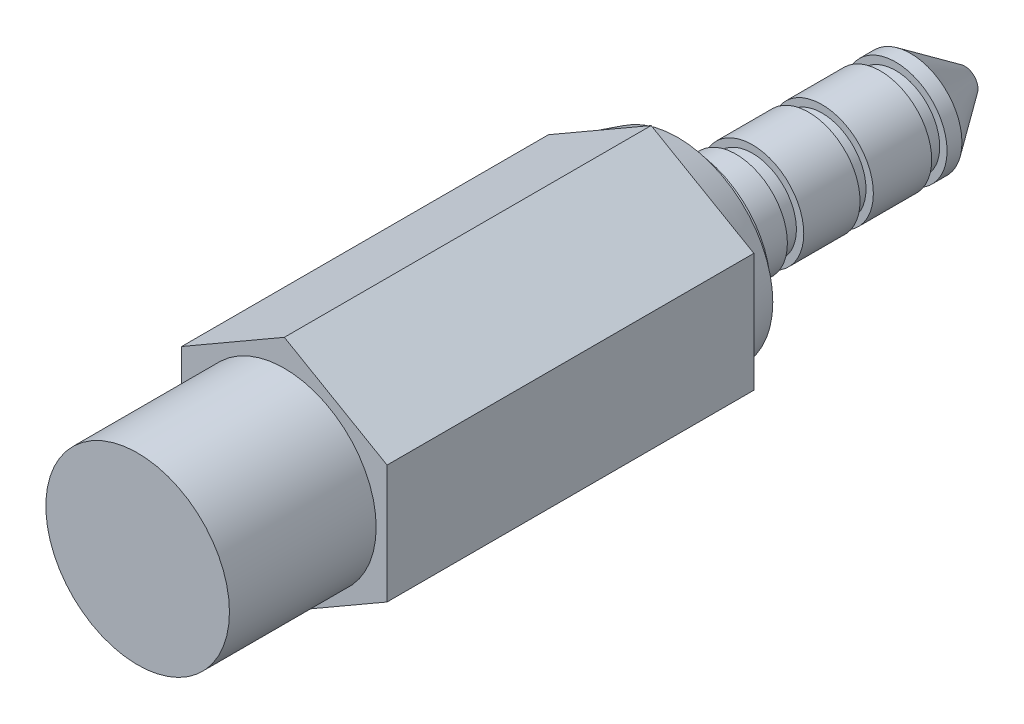
ISO-10303-21;
HEADER;
FILE_DESCRIPTION(('STEP AP214'),'2;1');
FILE_NAME('part.step','',(''),(''),'','','');
FILE_SCHEMA(('AUTOMOTIVE_DESIGN { 1 0 10303 214 1 1 1 1 }'));
ENDSEC;
DATA;
#1=APPLICATION_CONTEXT('core data for automotive mechanical design processes');
#2=APPLICATION_PROTOCOL_DEFINITION('international standard','automotive_design',2000,#1);
#3=PRODUCT_CONTEXT('',#1,'mechanical');
#4=PRODUCT('Part','Part','',(#3));
#5=PRODUCT_RELATED_PRODUCT_CATEGORY('part','',(#4));
#6=PRODUCT_DEFINITION_FORMATION('','',#4);
#7=PRODUCT_DEFINITION_CONTEXT('part definition',#1,'design');
#8=PRODUCT_DEFINITION('design','',#6,#7);
#9=PRODUCT_DEFINITION_SHAPE('','',#8);
#10=(LENGTH_UNIT() NAMED_UNIT(*) SI_UNIT(.MILLI.,.METRE.));
#11=(NAMED_UNIT(*) PLANE_ANGLE_UNIT() SI_UNIT($,.RADIAN.));
#12=(NAMED_UNIT(*) SI_UNIT($,.STERADIAN.) SOLID_ANGLE_UNIT());
#13=UNCERTAINTY_MEASURE_WITH_UNIT(LENGTH_MEASURE(1.E-05),#10,'distance_accuracy_value','');
#14=(GEOMETRIC_REPRESENTATION_CONTEXT(3) GLOBAL_UNCERTAINTY_ASSIGNED_CONTEXT((#13)) GLOBAL_UNIT_ASSIGNED_CONTEXT((#10,
#11,#12)) REPRESENTATION_CONTEXT('',''));
#15=CARTESIAN_POINT('',(0.,0.,0.));
#16=DIRECTION('',(0.,0.,1.));
#17=DIRECTION('',(1.,0.,0.));
#18=AXIS2_PLACEMENT_3D('',#15,#16,#17);
#19=CARTESIAN_POINT('',(0.,0.,0.));
#20=DIRECTION('',(0.,0.,1.));
#21=DIRECTION('',(1.,0.,0.));
#22=AXIS2_PLACEMENT_3D('',#19,#20,#21);
#23=PLANE('',#22);
#24=DIRECTION('',(0.,1.,0.));
#25=VECTOR('',#24,1.);
#26=CARTESIAN_POINT('',(7.00000000000001,-4.04145188432738,0.));
#27=LINE('',#26,#25);
#28=CARTESIAN_POINT('',(7.00000000000001,0.,0.));
#29=VERTEX_POINT('',#28);
#30=CARTESIAN_POINT('',(7.00000000000001,4.04145188432738,0.));
#31=VERTEX_POINT('',#30);
#32=EDGE_CURVE('E156',#29,#31,#27,.T.);
#33=ORIENTED_EDGE('',*,*,#32,.F.);
#34=CARTESIAN_POINT('',(0.,0.,0.));
#35=DIRECTION('',(0.,0.,1.));
#36=DIRECTION('',(1.,0.,0.));
#37=AXIS2_PLACEMENT_3D('',#34,#35,#36);
#38=CIRCLE('',#37,7.);
#39=CARTESIAN_POINT('',(3.5,6.06217782649107,0.));
#40=VERTEX_POINT('',#39);
#41=EDGE_CURVE('E57',#29,#40,#38,.T.);
#42=ORIENTED_EDGE('',*,*,#41,.T.);
#43=DIRECTION('',(-0.866025403784439,0.5,0.));
#44=VECTOR('',#43,1.);
#45=CARTESIAN_POINT('',(7.00000000000001,4.04145188432738,0.));
#46=LINE('',#45,#44);
#47=EDGE_CURVE('E160',#31,#40,#46,.T.);
#48=ORIENTED_EDGE('',*,*,#47,.F.);
#49=EDGE_LOOP('',(#33,#42,#48));
#50=FACE_BOUND('',#49,.T.);
#51=ADVANCED_FACE('F46',(#50),#23,.F.);
#52=CARTESIAN_POINT('',(0.,8.08290376865477,0.));
#53=VERTEX_POINT('',#52);
#54=EDGE_CURVE('E134',#40,#53,#46,.T.);
#55=ORIENTED_EDGE('',*,*,#54,.F.);
#56=CARTESIAN_POINT('',(-3.5,6.06217782649107,0.));
#57=VERTEX_POINT('',#56);
#58=EDGE_CURVE('E13',#40,#57,#38,.T.);
#59=ORIENTED_EDGE('',*,*,#58,.T.);
#60=DIRECTION('',(-0.866025403784439,-0.5,0.));
#61=VECTOR('',#60,1.);
#62=CARTESIAN_POINT('',(0.,8.08290376865477,0.));
#63=LINE('',#62,#61);
#64=EDGE_CURVE('E163',#53,#57,#63,.T.);
#65=ORIENTED_EDGE('',*,*,#64,.F.);
#66=EDGE_LOOP('',(#55,#59,#65));
#67=FACE_BOUND('',#66,.T.);
#68=ADVANCED_FACE('F276',(#67),#23,.F.);
#69=CARTESIAN_POINT('',(-7.00000000000001,4.04145188432738,0.));
#70=VERTEX_POINT('',#69);
#71=EDGE_CURVE('E162',#57,#70,#63,.T.);
#72=ORIENTED_EDGE('',*,*,#71,.F.);
#73=CARTESIAN_POINT('',(-7.00000000000001,0.,0.));
#74=VERTEX_POINT('',#73);
#75=EDGE_CURVE('E55',#57,#74,#38,.T.);
#76=ORIENTED_EDGE('',*,*,#75,.T.);
#77=DIRECTION('',(0.,-1.,0.));
#78=VECTOR('',#77,1.);
#79=CARTESIAN_POINT('',(-7.00000000000001,4.04145188432738,0.));
#80=LINE('',#79,#78);
#81=EDGE_CURVE('E165',#70,#74,#80,.T.);
#82=ORIENTED_EDGE('',*,*,#81,.F.);
#83=EDGE_LOOP('',(#72,#76,#82));
#84=FACE_BOUND('',#83,.T.);
#85=ADVANCED_FACE('F271',(#84),#23,.F.);
#86=CARTESIAN_POINT('',(-7.00000000000001,-4.04145188432738,0.));
#87=VERTEX_POINT('',#86);
#88=EDGE_CURVE('E99',#74,#87,#80,.T.);
#89=ORIENTED_EDGE('',*,*,#88,.F.);
#90=CARTESIAN_POINT('',(-3.5,-6.06217782649107,0.));
#91=VERTEX_POINT('',#90);
#92=EDGE_CURVE('E181',#74,#91,#38,.T.);
#93=ORIENTED_EDGE('',*,*,#92,.T.);
#94=DIRECTION('',(0.866025403784439,-0.5,0.));
#95=VECTOR('',#94,1.);
#96=CARTESIAN_POINT('',(-7.00000000000001,-4.04145188432738,0.));
#97=LINE('',#96,#95);
#98=EDGE_CURVE('E148',#87,#91,#97,.T.);
#99=ORIENTED_EDGE('',*,*,#98,.F.);
#100=EDGE_LOOP('',(#89,#93,#99));
#101=FACE_BOUND('',#100,.T.);
#102=ADVANCED_FACE('F267',(#101),#23,.F.);
#103=CARTESIAN_POINT('',(0.,-8.08290376865477,0.));
#104=VERTEX_POINT('',#103);
#105=EDGE_CURVE('E152',#91,#104,#97,.T.);
#106=ORIENTED_EDGE('',*,*,#105,.F.);
#107=CARTESIAN_POINT('',(3.5,-6.06217782649107,0.));
#108=VERTEX_POINT('',#107);
#109=EDGE_CURVE('E176',#91,#108,#38,.T.);
#110=ORIENTED_EDGE('',*,*,#109,.T.);
#111=DIRECTION('',(0.866025403784439,0.5,0.));
#112=VECTOR('',#111,1.);
#113=CARTESIAN_POINT('',(0.,-8.08290376865477,0.));
#114=LINE('',#113,#112);
#115=EDGE_CURVE('E153',#104,#108,#114,.T.);
#116=ORIENTED_EDGE('',*,*,#115,.F.);
#117=EDGE_LOOP('',(#106,#110,#116));
#118=FACE_BOUND('',#117,.T.);
#119=ADVANCED_FACE('F257',(#118),#23,.F.);
#120=CARTESIAN_POINT('',(-7.00000000000001,-4.04145188432738,25.));
#121=DIRECTION('',(0.5,0.866025403784439,0.));
#122=DIRECTION('',(-0.866025403784439,0.5,0.));
#123=AXIS2_PLACEMENT_3D('',#120,#121,#122);
#124=PLANE('',#123);
#125=ORIENTED_EDGE('',*,*,#98,.T.);
#126=ORIENTED_EDGE('',*,*,#105,.T.);
#127=DIRECTION('',(0.,0.,-1.));
#128=VECTOR('',#127,1.);
#129=CARTESIAN_POINT('',(0.,-8.08290376865477,25.));
#130=LINE('',#129,#128);
#131=CARTESIAN_POINT('',(0.,-8.08290376865477,25.));
#132=VERTEX_POINT('',#131);
#133=EDGE_CURVE('E50',#132,#104,#130,.T.);
#134=ORIENTED_EDGE('',*,*,#133,.F.);
#135=DIRECTION('',(0.866025403784439,-0.5,0.));
#136=VECTOR('',#135,1.);
#137=CARTESIAN_POINT('',(-7.00000000000001,-4.04145188432738,25.));
#138=LINE('',#137,#136);
#139=CARTESIAN_POINT('',(-7.00000000000001,-4.04145188432738,25.));
#140=VERTEX_POINT('',#139);
#141=EDGE_CURVE('E167',#140,#132,#138,.T.);
#142=ORIENTED_EDGE('',*,*,#141,.F.);
#143=DIRECTION('',(0.,0.,-1.));
#144=VECTOR('',#143,1.);
#145=CARTESIAN_POINT('',(-7.00000000000001,-4.04145188432738,25.));
#146=LINE('',#145,#144);
#147=EDGE_CURVE('E144',#140,#87,#146,.T.);
#148=ORIENTED_EDGE('',*,*,#147,.T.);
#149=EDGE_LOOP('',(#125,#126,#134,#142,#148));
#150=FACE_BOUND('',#149,.T.);
#151=ADVANCED_FACE('F48',(#150),#124,.F.);
#152=CARTESIAN_POINT('',(0.,-8.08290376865477,25.));
#153=DIRECTION('',(-0.5,0.866025403784439,0.));
#154=DIRECTION('',(-0.866025403784439,-0.5,0.));
#155=AXIS2_PLACEMENT_3D('',#152,#153,#154);
#156=PLANE('',#155);
#157=ORIENTED_EDGE('',*,*,#115,.T.);
#158=CARTESIAN_POINT('',(7.00000000000001,-4.04145188432738,0.));
#159=VERTEX_POINT('',#158);
#160=EDGE_CURVE('E151',#108,#159,#114,.T.);
#161=ORIENTED_EDGE('',*,*,#160,.T.);
#162=DIRECTION('',(0.,0.,-1.));
#163=VECTOR('',#162,1.);
#164=CARTESIAN_POINT('',(7.00000000000001,-4.04145188432738,25.));
#165=LINE('',#164,#163);
#166=CARTESIAN_POINT('',(7.00000000000001,-4.04145188432738,25.));
#167=VERTEX_POINT('',#166);
#168=EDGE_CURVE('E170',#167,#159,#165,.T.);
#169=ORIENTED_EDGE('',*,*,#168,.F.);
#170=DIRECTION('',(0.866025403784439,0.5,0.));
#171=VECTOR('',#170,1.);
#172=CARTESIAN_POINT('',(0.,-8.08290376865477,25.));
#173=LINE('',#172,#171);
#174=EDGE_CURVE('E108',#132,#167,#173,.T.);
#175=ORIENTED_EDGE('',*,*,#174,.F.);
#176=ORIENTED_EDGE('',*,*,#133,.T.);
#177=EDGE_LOOP('',(#157,#161,#169,#175,#176));
#178=FACE_BOUND('',#177,.T.);
#179=ADVANCED_FACE('F250',(#178),#156,.F.);
#180=CARTESIAN_POINT('',(7.00000000000001,-4.04145188432738,25.));
#181=DIRECTION('',(-1.,0.,0.));
#182=DIRECTION('',(0.,-1.,0.));
#183=AXIS2_PLACEMENT_3D('',#180,#181,#182);
#184=PLANE('',#183);
#185=EDGE_CURVE('E157',#159,#29,#27,.T.);
#186=ORIENTED_EDGE('',*,*,#185,.T.);
#187=ORIENTED_EDGE('',*,*,#32,.T.);
#188=DIRECTION('',(0.,0.,-1.));
#189=VECTOR('',#188,1.);
#190=CARTESIAN_POINT('',(7.00000000000001,4.04145188432738,25.));
#191=LINE('',#190,#189);
#192=CARTESIAN_POINT('',(7.00000000000001,4.04145188432738,25.));
#193=VERTEX_POINT('',#192);
#194=EDGE_CURVE('E138',#193,#31,#191,.T.);
#195=ORIENTED_EDGE('',*,*,#194,.F.);
#196=DIRECTION('',(0.,1.,0.));
#197=VECTOR('',#196,1.);
#198=CARTESIAN_POINT('',(7.00000000000001,-4.04145188432738,25.));
#199=LINE('',#198,#197);
#200=EDGE_CURVE('E124',#167,#193,#199,.T.);
#201=ORIENTED_EDGE('',*,*,#200,.F.);
#202=ORIENTED_EDGE('',*,*,#168,.T.);
#203=EDGE_LOOP('',(#186,#187,#195,#201,#202));
#204=FACE_BOUND('',#203,.T.);
#205=ADVANCED_FACE('F251',(#204),#184,.F.);
#206=CARTESIAN_POINT('',(7.00000000000001,4.04145188432738,25.));
#207=DIRECTION('',(-0.5,-0.866025403784439,0.));
#208=DIRECTION('',(0.866025403784439,-0.5,0.));
#209=AXIS2_PLACEMENT_3D('',#206,#207,#208);
#210=PLANE('',#209);
#211=ORIENTED_EDGE('',*,*,#47,.T.);
#212=ORIENTED_EDGE('',*,*,#54,.T.);
#213=DIRECTION('',(0.,0.,-1.));
#214=VECTOR('',#213,1.);
#215=CARTESIAN_POINT('',(0.,8.08290376865477,25.));
#216=LINE('',#215,#214);
#217=CARTESIAN_POINT('',(0.,8.08290376865477,25.));
#218=VERTEX_POINT('',#217);
#219=EDGE_CURVE('E130',#218,#53,#216,.T.);
#220=ORIENTED_EDGE('',*,*,#219,.F.);
#221=DIRECTION('',(-0.866025403784439,0.5,0.));
#222=VECTOR('',#221,1.);
#223=CARTESIAN_POINT('',(7.00000000000001,4.04145188432738,25.));
#224=LINE('',#223,#222);
#225=EDGE_CURVE('E117',#193,#218,#224,.T.);
#226=ORIENTED_EDGE('',*,*,#225,.F.);
#227=ORIENTED_EDGE('',*,*,#194,.T.);
#228=EDGE_LOOP('',(#211,#212,#220,#226,#227));
#229=FACE_BOUND('',#228,.T.);
#230=ADVANCED_FACE('F132',(#229),#210,.F.);
#231=CARTESIAN_POINT('',(0.,8.08290376865477,25.));
#232=DIRECTION('',(0.5,-0.866025403784438,0.));
#233=DIRECTION('',(0.866025403784438,0.5,0.));
#234=AXIS2_PLACEMENT_3D('',#231,#232,#233);
#235=PLANE('',#234);
#236=ORIENTED_EDGE('',*,*,#64,.T.);
#237=ORIENTED_EDGE('',*,*,#71,.T.);
#238=DIRECTION('',(0.,0.,-1.));
#239=VECTOR('',#238,1.);
#240=CARTESIAN_POINT('',(-7.00000000000001,4.04145188432738,25.));
#241=LINE('',#240,#239);
#242=CARTESIAN_POINT('',(-7.00000000000001,4.04145188432738,25.));
#243=VERTEX_POINT('',#242);
#244=EDGE_CURVE('E139',#243,#70,#241,.T.);
#245=ORIENTED_EDGE('',*,*,#244,.F.);
#246=DIRECTION('',(-0.866025403784439,-0.5,0.));
#247=VECTOR('',#246,1.);
#248=CARTESIAN_POINT('',(0.,8.08290376865477,25.));
#249=LINE('',#248,#247);
#250=EDGE_CURVE('E121',#218,#243,#249,.T.);
#251=ORIENTED_EDGE('',*,*,#250,.F.);
#252=ORIENTED_EDGE('',*,*,#219,.T.);
#253=EDGE_LOOP('',(#236,#237,#245,#251,#252));
#254=FACE_BOUND('',#253,.T.);
#255=ADVANCED_FACE('F141',(#254),#235,.F.);
#256=CARTESIAN_POINT('',(-7.00000000000001,4.04145188432738,25.));
#257=DIRECTION('',(1.,0.,0.));
#258=DIRECTION('',(0.,0.,-1.));
#259=AXIS2_PLACEMENT_3D('',#256,#257,#258);
#260=PLANE('',#259);
#261=ORIENTED_EDGE('',*,*,#81,.T.);
#262=ORIENTED_EDGE('',*,*,#88,.T.);
#263=ORIENTED_EDGE('',*,*,#147,.F.);
#264=DIRECTION('',(0.,-1.,0.));
#265=VECTOR('',#264,1.);
#266=CARTESIAN_POINT('',(-7.00000000000001,4.04145188432738,25.));
#267=LINE('',#266,#265);
#268=EDGE_CURVE('E72',#243,#140,#267,.T.);
#269=ORIENTED_EDGE('',*,*,#268,.F.);
#270=ORIENTED_EDGE('',*,*,#244,.T.);
#271=EDGE_LOOP('',(#261,#262,#263,#269,#270));
#272=FACE_BOUND('',#271,.T.);
#273=ADVANCED_FACE('F278',(#272),#260,.F.);
#274=CARTESIAN_POINT('',(0.,0.,25.));
#275=DIRECTION('',(0.,0.,1.));
#276=DIRECTION('',(1.,0.,0.));
#277=AXIS2_PLACEMENT_3D('',#274,#275,#276);
#278=PLANE('',#277);
#279=CARTESIAN_POINT('',(0.,0.,25.));
#280=DIRECTION('',(0.,0.,1.));
#281=DIRECTION('',(1.,0.,0.));
#282=AXIS2_PLACEMENT_3D('',#279,#280,#281);
#283=CIRCLE('',#282,6.2576296110513);
#284=CARTESIAN_POINT('',(6.2576296110513,0.,25.));
#285=VERTEX_POINT('',#284);
#286=EDGE_CURVE('E242',#285,#285,#283,.T.);
#287=ORIENTED_EDGE('',*,*,#286,.F.);
#288=EDGE_LOOP('',(#287));
#289=FACE_BOUND('',#288,.T.);
#290=ORIENTED_EDGE('',*,*,#141,.T.);
#291=ORIENTED_EDGE('',*,*,#174,.T.);
#292=ORIENTED_EDGE('',*,*,#200,.T.);
#293=ORIENTED_EDGE('',*,*,#225,.T.);
#294=ORIENTED_EDGE('',*,*,#250,.T.);
#295=ORIENTED_EDGE('',*,*,#268,.T.);
#296=EDGE_LOOP('',(#290,#291,#292,#293,#294,#295));
#297=FACE_BOUND('',#296,.T.);
#298=ADVANCED_FACE('F119',(#289,#297),#278,.T.);
#299=ORIENTED_EDGE('',*,*,#160,.F.);
#300=EDGE_CURVE('E174',#108,#29,#38,.T.);
#301=ORIENTED_EDGE('',*,*,#300,.T.);
#302=ORIENTED_EDGE('',*,*,#185,.F.);
#303=EDGE_LOOP('',(#299,#301,#302));
#304=FACE_BOUND('',#303,.T.);
#305=ADVANCED_FACE('F252',(#304),#23,.F.);
#306=CARTESIAN_POINT('',(0.,0.,35.));
#307=DIRECTION('',(0.,0.,-1.));
#308=DIRECTION('',(-1.,0.,0.));
#309=AXIS2_PLACEMENT_3D('',#306,#307,#308);
#310=CYLINDRICAL_SURFACE('',#309,6.2576296110513);
#311=CARTESIAN_POINT('',(0.,0.,35.));
#312=DIRECTION('',(0.,0.,1.));
#313=DIRECTION('',(1.,0.,0.));
#314=AXIS2_PLACEMENT_3D('',#311,#312,#313);
#315=CIRCLE('',#314,6.2576296110513);
#316=CARTESIAN_POINT('',(6.2576296110513,0.,35.));
#317=VERTEX_POINT('',#316);
#318=EDGE_CURVE('E243',#317,#317,#315,.T.);
#319=ORIENTED_EDGE('',*,*,#318,.F.);
#320=EDGE_LOOP('',(#319));
#321=FACE_BOUND('',#320,.T.);
#322=ORIENTED_EDGE('',*,*,#286,.T.);
#323=EDGE_LOOP('',(#322));
#324=FACE_BOUND('',#323,.T.);
#325=ADVANCED_FACE('F293',(#321,#324),#310,.T.);
#326=CARTESIAN_POINT('',(0.,0.,35.));
#327=DIRECTION('',(0.,0.,1.));
#328=DIRECTION('',(1.,0.,0.));
#329=AXIS2_PLACEMENT_3D('',#326,#327,#328);
#330=PLANE('',#329);
#331=ORIENTED_EDGE('',*,*,#318,.T.);
#332=EDGE_LOOP('',(#331));
#333=FACE_BOUND('',#332,.T.);
#334=ADVANCED_FACE('F298',(#333),#330,.T.);
#335=CARTESIAN_POINT('',(0.,0.,-21.3821255905451));
#336=DIRECTION('',(0.,0.,-1.));
#337=DIRECTION('',(-1.,0.,0.));
#338=AXIS2_PLACEMENT_3D('',#335,#336,#337);
#339=PLANE('',#338);
#340=CARTESIAN_POINT('',(0.,0.,-21.3821255905451));
#341=DIRECTION('',(0.,0.,1.));
#342=DIRECTION('',(1.,0.,0.));
#343=AXIS2_PLACEMENT_3D('',#340,#341,#342);
#344=CIRCLE('',#343,0.894479356480703);
#345=CARTESIAN_POINT('',(0.894479356480697,0.,-21.3821255905451));
#346=VERTEX_POINT('',#345);
#347=EDGE_CURVE('E239',#346,#346,#344,.T.);
#348=ORIENTED_EDGE('',*,*,#347,.F.);
#349=EDGE_LOOP('',(#348));
#350=FACE_BOUND('',#349,.T.);
#351=ADVANCED_FACE('F309',(#350),#339,.T.);
#352=CARTESIAN_POINT('',(0.,0.,-17.6825292365084));
#353=DIRECTION('',(0.,0.,1.));
#354=DIRECTION('',(1.,0.,0.));
#355=AXIS2_PLACEMENT_3D('',#352,#353,#354);
#356=CONICAL_SURFACE('',#355,3.5,0.613587060562772);
#357=CARTESIAN_POINT('',(0.,0.,-17.6825292365084));
#358=DIRECTION('',(0.,0.,1.));
#359=DIRECTION('',(1.,0.,0.));
#360=AXIS2_PLACEMENT_3D('',#357,#358,#359);
#361=CIRCLE('',#360,3.5);
#362=CARTESIAN_POINT('',(3.5,0.,-17.6825292365084));
#363=VERTEX_POINT('',#362);
#364=EDGE_CURVE('E236',#363,#363,#361,.T.);
#365=CARTESIAN_POINT('',(0.894479356480697,0.,-21.3821255905451));
#366=CARTESIAN_POINT('',(0.921620196517356,0.,-21.3435881285239));
#367=CARTESIAN_POINT('',(0.948761036554016,0.,-21.3050506665027));
#368=CARTESIAN_POINT('',(1.00304271662734,0.,-21.2279757424603));
#369=CARTESIAN_POINT('',(1.03018355666399,0.,-21.1894382804391));
#370=CARTESIAN_POINT('',(1.08446523673731,0.,-21.1123633563966));
#371=CARTESIAN_POINT('',(1.11160607677397,0.,-21.0738258943754));
#372=CARTESIAN_POINT('',(1.16588775684729,0.,-20.996750970333));
#373=CARTESIAN_POINT('',(1.19302859688395,0.,-20.9582135083118));
#374=CARTESIAN_POINT('',(1.24731027695727,0.,-20.8811385842693));
#375=CARTESIAN_POINT('',(1.27445111699393,0.,-20.8426011222481));
#376=CARTESIAN_POINT('',(1.32873279706725,0.,-20.7655261982057));
#377=CARTESIAN_POINT('',(1.35587363710391,0.,-20.7269887361845));
#378=CARTESIAN_POINT('',(1.41015531717723,0.,-20.649913812142));
#379=CARTESIAN_POINT('',(1.43729615721389,0.,-20.6113763501208));
#380=CARTESIAN_POINT('',(1.4915778372872,0.,-20.5343014260784));
#381=CARTESIAN_POINT('',(1.51871867732386,0.,-20.4957639640572));
#382=CARTESIAN_POINT('',(1.57300035739718,0.,-20.4186890400147));
#383=CARTESIAN_POINT('',(1.60014119743384,0.,-20.3801515779935));
#384=CARTESIAN_POINT('',(1.65442287750716,0.,-20.3030766539511));
#385=CARTESIAN_POINT('',(1.68156371754382,0.,-20.2645391919299));
#386=CARTESIAN_POINT('',(1.73584539761714,0.,-20.1874642678874));
#387=CARTESIAN_POINT('',(1.7629862376538,0.,-20.1489268058662));
#388=CARTESIAN_POINT('',(1.81726791772712,0.,-20.0718518818238));
#389=CARTESIAN_POINT('',(1.84440875776378,0.,-20.0333144198026));
#390=CARTESIAN_POINT('',(1.8986904378371,0.,-19.9562394957601));
#391=CARTESIAN_POINT('',(1.92583127787375,0.,-19.9177020337389));
#392=CARTESIAN_POINT('',(1.98011295794707,0.,-19.8406271096965));
#393=CARTESIAN_POINT('',(2.00725379798373,0.,-19.8020896476753));
#394=CARTESIAN_POINT('',(2.06153547805705,0.,-19.7250147236329));
#395=CARTESIAN_POINT('',(2.08867631809371,0.,-19.6864772616116));
#396=CARTESIAN_POINT('',(2.14295799816703,0.,-19.6094023375692));
#397=CARTESIAN_POINT('',(2.17009883820369,0.,-19.570864875548));
#398=CARTESIAN_POINT('',(2.22438051827701,0.,-19.4937899515056));
#399=CARTESIAN_POINT('',(2.25152135831367,0.,-19.4552524894843));
#400=CARTESIAN_POINT('',(2.30580303838699,0.,-19.3781775654419));
#401=CARTESIAN_POINT('',(2.33294387842365,0.,-19.3396401034207));
#402=CARTESIAN_POINT('',(2.38722555849696,0.,-19.2625651793783));
#403=CARTESIAN_POINT('',(2.41436639853362,0.,-19.224027717357));
#404=CARTESIAN_POINT('',(2.46864807860694,0.,-19.1469527933146));
#405=CARTESIAN_POINT('',(2.4957889186436,0.,-19.1084153312934));
#406=CARTESIAN_POINT('',(2.55007059871692,0.,-19.031340407251));
#407=CARTESIAN_POINT('',(2.57721143875358,0.,-18.9928029452297));
#408=CARTESIAN_POINT('',(2.6314931188269,0.,-18.9157280211873));
#409=CARTESIAN_POINT('',(2.65863395886356,0.,-18.8771905591661));
#410=CARTESIAN_POINT('',(2.71291563893688,0.,-18.8001156351237));
#411=CARTESIAN_POINT('',(2.74005647897354,0.,-18.7615781731024));
#412=CARTESIAN_POINT('',(2.79433815904686,0.,-18.68450324906));
#413=CARTESIAN_POINT('',(2.82147899908351,0.,-18.6459657870388));
#414=CARTESIAN_POINT('',(2.87576067915683,0.,-18.5688908629964));
#415=CARTESIAN_POINT('',(2.90290151919349,0.,-18.5303534009752));
#416=CARTESIAN_POINT('',(2.95718319926681,0.,-18.4532784769327));
#417=CARTESIAN_POINT('',(2.98432403930347,0.,-18.4147410149115));
#418=CARTESIAN_POINT('',(3.03860571937679,0.,-18.3376660908691));
#419=CARTESIAN_POINT('',(3.06574655941345,0.,-18.2991286288479));
#420=CARTESIAN_POINT('',(3.12002823948677,0.,-18.2220537048054));
#421=CARTESIAN_POINT('',(3.14716907952343,0.,-18.1835162427842));
#422=CARTESIAN_POINT('',(3.20145075959675,0.,-18.1064413187418));
#423=CARTESIAN_POINT('',(3.22859159963341,0.,-18.0679038567206));
#424=CARTESIAN_POINT('',(3.28287327970672,0.,-17.9908289326781));
#425=CARTESIAN_POINT('',(3.31001411974338,0.,-17.9522914706569));
#426=CARTESIAN_POINT('',(3.3642957998167,0.,-17.8752165466145));
#427=CARTESIAN_POINT('',(3.39143663985336,0.,-17.8366790845933));
#428=CARTESIAN_POINT('',(3.44571831992668,0.,-17.7596041605508));
#429=CARTESIAN_POINT('',(3.47285915996334,0.,-17.7210666985296));
#430=CARTESIAN_POINT('',(3.5,0.,-17.6825292365084));
#431=B_SPLINE_CURVE_WITH_KNOTS('',3,(#365,#366,#367,#368,#369,#370,#371,#372,#373,#374,#375,
#376,#377,#378,#379,#380,#381,#382,#383,#384,#385,#386,#387,#388,#389,#390,#391,#392,#393,#394,
#395,#396,#397,#398,#399,#400,#401,#402,#403,#404,#405,#406,#407,#408,#409,#410,#411,#412,#413,
#414,#415,#416,#417,#418,#419,#420,#421,#422,#423,#424,#425,#426,#427,#428,#429,#430),
.UNSPECIFIED.,.F.,.F.,(4,2,2,2,2,2,2,2,2,2,2,2,2,2,2,2,2,2,2,2,2,2,2,2,2,2,2,2,2,2,2,2,4),(0.,
0.141406685105018,0.282813370210036,0.424220055315053,0.565626740420071,0.707033425525092,
0.848440110630109,0.989846795735127,1.13125348084015,1.27266016594517,1.41406685105018,
1.5554735361552,1.69688022126022,1.83828690636524,1.97969359147026,2.12110027657527,
2.2625069616803,2.40391364678531,2.54532033189033,2.68672701699535,2.82813370210037,
2.96954038720539,3.11094707231041,3.25235375741542,3.39376044252044,3.53516712762546,
3.67657381273048,3.8179804978355,3.95938718294052,4.10079386804554,4.24220055315056,
4.38360723825557,4.52501392336059),.UNSPECIFIED.);
#432=EDGE_CURVE('BSEAM313',#346,#363,#431,.T.);
#433=ORIENTED_EDGE('',*,*,#347,.T.);
#434=ORIENTED_EDGE('',*,*,#364,.F.);
#435=ORIENTED_EDGE('',*,*,#432,.T.);
#436=ORIENTED_EDGE('',*,*,#432,.F.);
#437=EDGE_LOOP('',(#433,#435,#434,#436));
#438=FACE_BOUND('',#437,.T.);
#439=ADVANCED_FACE('F313',(#438),#356,.T.);
#440=CARTESIAN_POINT('',(0.,0.,0.));
#441=DIRECTION('',(0.,0.,1.));
#442=DIRECTION('',(1.,0.,0.));
#443=AXIS2_PLACEMENT_3D('',#440,#441,#442);
#444=CYLINDRICAL_SURFACE('',#443,3.5);
#445=ORIENTED_EDGE('',*,*,#364,.T.);
#446=EDGE_LOOP('',(#445));
#447=FACE_BOUND('',#446,.T.);
#448=CARTESIAN_POINT('',(0.,0.,-16.666829394691));
#449=DIRECTION('',(0.,0.,1.));
#450=DIRECTION('',(1.,0.,0.));
#451=AXIS2_PLACEMENT_3D('',#448,#449,#450);
#452=CIRCLE('',#451,3.5);
#453=CARTESIAN_POINT('',(3.5,0.,-16.666829394691));
#454=VERTEX_POINT('',#453);
#455=EDGE_CURVE('E233',#454,#454,#452,.T.);
#456=ORIENTED_EDGE('',*,*,#455,.F.);
#457=EDGE_LOOP('',(#456));
#458=FACE_BOUND('',#457,.T.);
#459=ADVANCED_FACE('F317',(#447,#458),#444,.T.);
#460=CARTESIAN_POINT('',(3.5,0.,-16.666829394691));
#461=DIRECTION('',(0.,0.,1.));
#462=DIRECTION('',(1.,0.,0.));
#463=AXIS2_PLACEMENT_3D('',#460,#461,#462);
#464=PLANE('',#463);
#465=ORIENTED_EDGE('',*,*,#455,.T.);
#466=EDGE_LOOP('',(#465));
#467=FACE_BOUND('',#466,.T.);
#468=CARTESIAN_POINT('',(0.,0.,-16.666829394691));
#469=DIRECTION('',(0.,0.,1.));
#470=DIRECTION('',(1.,0.,0.));
#471=AXIS2_PLACEMENT_3D('',#468,#469,#470);
#472=CIRCLE('',#471,3.);
#473=CARTESIAN_POINT('',(3.,0.,-16.666829394691));
#474=VERTEX_POINT('',#473);
#475=EDGE_CURVE('E230',#474,#474,#472,.T.);
#476=ORIENTED_EDGE('',*,*,#475,.F.);
#477=EDGE_LOOP('',(#476));
#478=FACE_BOUND('',#477,.T.);
#479=ADVANCED_FACE('F321',(#467,#478),#464,.T.);
#480=CARTESIAN_POINT('',(0.,0.,0.));
#481=DIRECTION('',(0.,0.,1.));
#482=DIRECTION('',(1.,0.,0.));
#483=AXIS2_PLACEMENT_3D('',#480,#481,#482);
#484=CYLINDRICAL_SURFACE('',#483,3.);
#485=ORIENTED_EDGE('',*,*,#475,.T.);
#486=EDGE_LOOP('',(#485));
#487=FACE_BOUND('',#486,.T.);
#488=CARTESIAN_POINT('',(0.,0.,-15.6204633482037));
#489=DIRECTION('',(0.,0.,1.));
#490=DIRECTION('',(1.,0.,0.));
#491=AXIS2_PLACEMENT_3D('',#488,#489,#490);
#492=CIRCLE('',#491,3.);
#493=CARTESIAN_POINT('',(3.,0.,-15.6204633482037));
#494=VERTEX_POINT('',#493);
#495=EDGE_CURVE('E227',#494,#494,#492,.T.);
#496=ORIENTED_EDGE('',*,*,#495,.F.);
#497=EDGE_LOOP('',(#496));
#498=FACE_BOUND('',#497,.T.);
#499=ADVANCED_FACE('F325',(#487,#498),#484,.T.);
#500=CARTESIAN_POINT('',(3.,0.,-15.6204633482037));
#501=DIRECTION('',(0.,0.,-1.));
#502=DIRECTION('',(-1.,0.,0.));
#503=AXIS2_PLACEMENT_3D('',#500,#501,#502);
#504=PLANE('',#503);
#505=ORIENTED_EDGE('',*,*,#495,.T.);
#506=EDGE_LOOP('',(#505));
#507=FACE_BOUND('',#506,.T.);
#508=CARTESIAN_POINT('',(0.,0.,-15.6204633482037));
#509=DIRECTION('',(0.,0.,1.));
#510=DIRECTION('',(1.,0.,0.));
#511=AXIS2_PLACEMENT_3D('',#508,#509,#510);
#512=CIRCLE('',#511,3.5);
#513=CARTESIAN_POINT('',(3.5,0.,-15.6204633482037));
#514=VERTEX_POINT('',#513);
#515=EDGE_CURVE('E224',#514,#514,#512,.T.);
#516=ORIENTED_EDGE('',*,*,#515,.F.);
#517=EDGE_LOOP('',(#516));
#518=FACE_BOUND('',#517,.T.);
#519=ADVANCED_FACE('F329',(#507,#518),#504,.T.);
#520=CARTESIAN_POINT('',(0.,0.,0.));
#521=DIRECTION('',(0.,0.,1.));
#522=DIRECTION('',(1.,0.,0.));
#523=AXIS2_PLACEMENT_3D('',#520,#521,#522);
#524=CYLINDRICAL_SURFACE('',#523,3.5);
#525=ORIENTED_EDGE('',*,*,#515,.T.);
#526=EDGE_LOOP('',(#525));
#527=FACE_BOUND('',#526,.T.);
#528=CARTESIAN_POINT('',(0.,0.,-11.6442723715519));
#529=DIRECTION('',(0.,0.,1.));
#530=DIRECTION('',(1.,0.,0.));
#531=AXIS2_PLACEMENT_3D('',#528,#529,#530);
#532=CIRCLE('',#531,3.5);
#533=CARTESIAN_POINT('',(3.5,0.,-11.6442723715519));
#534=VERTEX_POINT('',#533);
#535=EDGE_CURVE('E221',#534,#534,#532,.T.);
#536=ORIENTED_EDGE('',*,*,#535,.F.);
#537=EDGE_LOOP('',(#536));
#538=FACE_BOUND('',#537,.T.);
#539=ADVANCED_FACE('F333',(#527,#538),#524,.T.);
#540=CARTESIAN_POINT('',(3.5,0.,-11.6442723715519));
#541=DIRECTION('',(0.,0.,1.));
#542=DIRECTION('',(1.,0.,0.));
#543=AXIS2_PLACEMENT_3D('',#540,#541,#542);
#544=PLANE('',#543);
#545=ORIENTED_EDGE('',*,*,#535,.T.);
#546=EDGE_LOOP('',(#545));
#547=FACE_BOUND('',#546,.T.);
#548=CARTESIAN_POINT('',(0.,0.,-11.6442723715519));
#549=DIRECTION('',(0.,0.,1.));
#550=DIRECTION('',(1.,0.,0.));
#551=AXIS2_PLACEMENT_3D('',#548,#549,#550);
#552=CIRCLE('',#551,3.);
#553=CARTESIAN_POINT('',(3.,0.,-11.6442723715519));
#554=VERTEX_POINT('',#553);
#555=EDGE_CURVE('E218',#554,#554,#552,.T.);
#556=ORIENTED_EDGE('',*,*,#555,.F.);
#557=EDGE_LOOP('',(#556));
#558=FACE_BOUND('',#557,.T.);
#559=ADVANCED_FACE('F337',(#547,#558),#544,.T.);
#560=CARTESIAN_POINT('',(0.,0.,0.));
#561=DIRECTION('',(0.,0.,1.));
#562=DIRECTION('',(1.,0.,0.));
#563=AXIS2_PLACEMENT_3D('',#560,#561,#562);
#564=CYLINDRICAL_SURFACE('',#563,3.);
#565=ORIENTED_EDGE('',*,*,#555,.T.);
#566=EDGE_LOOP('',(#565));
#567=FACE_BOUND('',#566,.T.);
#568=CARTESIAN_POINT('',(0.,0.,-10.7374217979296));
#569=DIRECTION('',(0.,0.,1.));
#570=DIRECTION('',(1.,0.,0.));
#571=AXIS2_PLACEMENT_3D('',#568,#569,#570);
#572=CIRCLE('',#571,3.);
#573=CARTESIAN_POINT('',(3.,0.,-10.7374217979296));
#574=VERTEX_POINT('',#573);
#575=EDGE_CURVE('E215',#574,#574,#572,.T.);
#576=ORIENTED_EDGE('',*,*,#575,.F.);
#577=EDGE_LOOP('',(#576));
#578=FACE_BOUND('',#577,.T.);
#579=ADVANCED_FACE('F341',(#567,#578),#564,.T.);
#580=CARTESIAN_POINT('',(3.,0.,-10.7374217979296));
#581=DIRECTION('',(0.,0.,-1.));
#582=DIRECTION('',(-1.,0.,0.));
#583=AXIS2_PLACEMENT_3D('',#580,#581,#582);
#584=PLANE('',#583);
#585=ORIENTED_EDGE('',*,*,#575,.T.);
#586=EDGE_LOOP('',(#585));
#587=FACE_BOUND('',#586,.T.);
#588=CARTESIAN_POINT('',(0.,0.,-10.7374217979296));
#589=DIRECTION('',(0.,0.,1.));
#590=DIRECTION('',(1.,0.,0.));
#591=AXIS2_PLACEMENT_3D('',#588,#589,#590);
#592=CIRCLE('',#591,3.5);
#593=CARTESIAN_POINT('',(3.5,0.,-10.7374217979296));
#594=VERTEX_POINT('',#593);
#595=EDGE_CURVE('E212',#594,#594,#592,.T.);
#596=ORIENTED_EDGE('',*,*,#595,.F.);
#597=EDGE_LOOP('',(#596));
#598=FACE_BOUND('',#597,.T.);
#599=ADVANCED_FACE('F345',(#587,#598),#584,.T.);
#600=CARTESIAN_POINT('',(0.,0.,0.));
#601=DIRECTION('',(0.,0.,1.));
#602=DIRECTION('',(1.,0.,0.));
#603=AXIS2_PLACEMENT_3D('',#600,#601,#602);
#604=CYLINDRICAL_SURFACE('',#603,3.5);
#605=ORIENTED_EDGE('',*,*,#595,.T.);
#606=EDGE_LOOP('',(#605));
#607=FACE_BOUND('',#606,.T.);
#608=CARTESIAN_POINT('',(0.,0.,-6.90074629414275));
#609=DIRECTION('',(0.,0.,1.));
#610=DIRECTION('',(1.,0.,0.));
#611=AXIS2_PLACEMENT_3D('',#608,#609,#610);
#612=CIRCLE('',#611,3.5);
#613=CARTESIAN_POINT('',(3.5,0.,-6.90074629414275));
#614=VERTEX_POINT('',#613);
#615=EDGE_CURVE('E209',#614,#614,#612,.T.);
#616=ORIENTED_EDGE('',*,*,#615,.F.);
#617=EDGE_LOOP('',(#616));
#618=FACE_BOUND('',#617,.T.);
#619=ADVANCED_FACE('F349',(#607,#618),#604,.T.);
#620=CARTESIAN_POINT('',(3.5,0.,-6.90074629414275));
#621=DIRECTION('',(0.,0.,1.));
#622=DIRECTION('',(1.,0.,0.));
#623=AXIS2_PLACEMENT_3D('',#620,#621,#622);
#624=PLANE('',#623);
#625=ORIENTED_EDGE('',*,*,#615,.T.);
#626=EDGE_LOOP('',(#625));
#627=FACE_BOUND('',#626,.T.);
#628=CARTESIAN_POINT('',(0.,0.,-6.90074629414275));
#629=DIRECTION('',(0.,0.,1.));
#630=DIRECTION('',(1.,0.,0.));
#631=AXIS2_PLACEMENT_3D('',#628,#629,#630);
#632=CIRCLE('',#631,3.);
#633=CARTESIAN_POINT('',(3.,0.,-6.90074629414275));
#634=VERTEX_POINT('',#633);
#635=EDGE_CURVE('E206',#634,#634,#632,.T.);
#636=ORIENTED_EDGE('',*,*,#635,.F.);
#637=EDGE_LOOP('',(#636));
#638=FACE_BOUND('',#637,.T.);
#639=ADVANCED_FACE('F353',(#627,#638),#624,.T.);
#640=CARTESIAN_POINT('',(0.,0.,0.));
#641=DIRECTION('',(0.,0.,1.));
#642=DIRECTION('',(1.,0.,0.));
#643=AXIS2_PLACEMENT_3D('',#640,#641,#642);
#644=CYLINDRICAL_SURFACE('',#643,3.);
#645=ORIENTED_EDGE('',*,*,#635,.T.);
#646=EDGE_LOOP('',(#645));
#647=FACE_BOUND('',#646,.T.);
#648=CARTESIAN_POINT('',(0.,0.,-5.78462251122294));
#649=DIRECTION('',(0.,0.,1.));
#650=DIRECTION('',(1.,0.,0.));
#651=AXIS2_PLACEMENT_3D('',#648,#649,#650);
#652=CIRCLE('',#651,3.);
#653=CARTESIAN_POINT('',(3.,0.,-5.78462251122294));
#654=VERTEX_POINT('',#653);
#655=EDGE_CURVE('E203',#654,#654,#652,.T.);
#656=ORIENTED_EDGE('',*,*,#655,.F.);
#657=EDGE_LOOP('',(#656));
#658=FACE_BOUND('',#657,.T.);
#659=ADVANCED_FACE('F357',(#647,#658),#644,.T.);
#660=CARTESIAN_POINT('',(3.,0.,-5.78462251122294));
#661=DIRECTION('',(0.,0.,-1.));
#662=DIRECTION('',(-1.,0.,0.));
#663=AXIS2_PLACEMENT_3D('',#660,#661,#662);
#664=PLANE('',#663);
#665=ORIENTED_EDGE('',*,*,#655,.T.);
#666=EDGE_LOOP('',(#665));
#667=FACE_BOUND('',#666,.T.);
#668=CARTESIAN_POINT('',(0.,0.,-5.78462251122294));
#669=DIRECTION('',(0.,0.,1.));
#670=DIRECTION('',(1.,0.,0.));
#671=AXIS2_PLACEMENT_3D('',#668,#669,#670);
#672=CIRCLE('',#671,3.5);
#673=CARTESIAN_POINT('',(3.5,0.,-5.78462251122294));
#674=VERTEX_POINT('',#673);
#675=EDGE_CURVE('E200',#674,#674,#672,.T.);
#676=ORIENTED_EDGE('',*,*,#675,.F.);
#677=EDGE_LOOP('',(#676));
#678=FACE_BOUND('',#677,.T.);
#679=ADVANCED_FACE('F361',(#667,#678),#664,.T.);
#680=CARTESIAN_POINT('',(0.,0.,0.));
#681=DIRECTION('',(0.,0.,1.));
#682=DIRECTION('',(1.,0.,0.));
#683=AXIS2_PLACEMENT_3D('',#680,#681,#682);
#684=CYLINDRICAL_SURFACE('',#683,3.5);
#685=ORIENTED_EDGE('',*,*,#675,.T.);
#686=EDGE_LOOP('',(#685));
#687=FACE_BOUND('',#686,.T.);
#688=CARTESIAN_POINT('',(0.,0.,-2.64552437176099));
#689=DIRECTION('',(0.,0.,1.));
#690=DIRECTION('',(1.,0.,0.));
#691=AXIS2_PLACEMENT_3D('',#688,#689,#690);
#692=CIRCLE('',#691,3.5);
#693=CARTESIAN_POINT('',(3.5,0.,-2.64552437176099));
#694=VERTEX_POINT('',#693);
#695=EDGE_CURVE('E197',#694,#694,#692,.T.);
#696=ORIENTED_EDGE('',*,*,#695,.F.);
#697=EDGE_LOOP('',(#696));
#698=FACE_BOUND('',#697,.T.);
#699=ADVANCED_FACE('F365',(#687,#698),#684,.T.);
#700=CARTESIAN_POINT('',(3.5,0.,-2.64552437176099));
#701=DIRECTION('',(0.,0.,-1.));
#702=DIRECTION('',(-1.,0.,0.));
#703=AXIS2_PLACEMENT_3D('',#700,#701,#702);
#704=PLANE('',#703);
#705=ORIENTED_EDGE('',*,*,#695,.T.);
#706=EDGE_LOOP('',(#705));
#707=FACE_BOUND('',#706,.T.);
#708=CARTESIAN_POINT('',(0.,0.,-2.64552437176099));
#709=DIRECTION('',(0.,0.,1.));
#710=DIRECTION('',(1.,0.,0.));
#711=AXIS2_PLACEMENT_3D('',#708,#709,#710);
#712=CIRCLE('',#711,5.46741564375747);
#713=CARTESIAN_POINT('',(5.46741564375747,0.,-2.64552437176099));
#714=VERTEX_POINT('',#713);
#715=EDGE_CURVE('E192',#714,#714,#712,.T.);
#716=ORIENTED_EDGE('',*,*,#715,.F.);
#717=EDGE_LOOP('',(#716));
#718=FACE_BOUND('',#717,.T.);
#719=ADVANCED_FACE('F369',(#707,#718),#704,.T.);
#720=CARTESIAN_POINT('',(0.,0.,0.));
#721=DIRECTION('',(0.,0.,1.));
#722=DIRECTION('',(1.,0.,0.));
#723=AXIS2_PLACEMENT_3D('',#720,#721,#722);
#724=CYLINDRICAL_SURFACE('',#723,5.46741564375747);
#725=ORIENTED_EDGE('',*,*,#715,.T.);
#726=EDGE_LOOP('',(#725));
#727=FACE_BOUND('',#726,.T.);
#728=CARTESIAN_POINT('',(0.,0.,-1.80843153457114));
#729=DIRECTION('',(0.,0.,1.));
#730=DIRECTION('',(1.,0.,0.));
#731=AXIS2_PLACEMENT_3D('',#728,#729,#730);
#732=CIRCLE('',#731,5.46741564375747);
#733=CARTESIAN_POINT('',(5.46741564375747,0.,-1.80843153457114));
#734=VERTEX_POINT('',#733);
#735=EDGE_CURVE('E188',#734,#734,#732,.T.);
#736=ORIENTED_EDGE('',*,*,#735,.F.);
#737=EDGE_LOOP('',(#736));
#738=FACE_BOUND('',#737,.T.);
#739=ADVANCED_FACE('F373',(#727,#738),#724,.T.);
#740=CARTESIAN_POINT('',(5.46741564375747,0.,-1.80843153457114));
#741=DIRECTION('',(0.,0.,-1.));
#742=DIRECTION('',(-1.,0.,0.));
#743=AXIS2_PLACEMENT_3D('',#740,#741,#742);
#744=PLANE('',#743);
#745=ORIENTED_EDGE('',*,*,#735,.T.);
#746=EDGE_LOOP('',(#745));
#747=FACE_BOUND('',#746,.T.);
#748=CARTESIAN_POINT('',(0.,0.,-1.80843153457114));
#749=DIRECTION('',(0.,0.,1.));
#750=DIRECTION('',(1.,0.,0.));
#751=AXIS2_PLACEMENT_3D('',#748,#749,#750);
#752=CIRCLE('',#751,6.48311548557485);
#753=CARTESIAN_POINT('',(6.48311548557485,0.,-1.80843153457114));
#754=VERTEX_POINT('',#753);
#755=EDGE_CURVE('E183',#754,#754,#752,.T.);
#756=ORIENTED_EDGE('',*,*,#755,.F.);
#757=EDGE_LOOP('',(#756));
#758=FACE_BOUND('',#757,.T.);
#759=ADVANCED_FACE('F377',(#747,#758),#744,.T.);
#760=CARTESIAN_POINT('',(0.,0.,0.));
#761=DIRECTION('',(0.,0.,1.));
#762=DIRECTION('',(1.,0.,0.));
#763=AXIS2_PLACEMENT_3D('',#760,#761,#762);
#764=CONICAL_SURFACE('',#763,7.,0.27839668319462);
#765=ORIENTED_EDGE('',*,*,#755,.T.);
#766=EDGE_LOOP('',(#765));
#767=FACE_BOUND('',#766,.T.);
#768=ORIENTED_EDGE('',*,*,#41,.F.);
#769=ORIENTED_EDGE('',*,*,#300,.F.);
#770=ORIENTED_EDGE('',*,*,#109,.F.);
#771=ORIENTED_EDGE('',*,*,#92,.F.);
#772=ORIENTED_EDGE('',*,*,#75,.F.);
#773=ORIENTED_EDGE('',*,*,#58,.F.);
#774=EDGE_LOOP('',(#768,#769,#770,#771,#772,#773));
#775=FACE_BOUND('',#774,.T.);
#776=ADVANCED_FACE('F261',(#767,#775),#764,.T.);
#777=CLOSED_SHELL('',(#51,#68,#85,#102,#119,#151,#179,#205,#230,#255,#273,#298,#305,#325,#334,
#351,#439,#459,#479,#499,#519,#539,#559,#579,#599,#619,#639,#659,#679,#699,#719,#739,#759,#776));
#778=MANIFOLD_SOLID_BREP('B2',#777);
#779=ADVANCED_BREP_SHAPE_REPRESENTATION('',(#18,#778),#14);
#780=SHAPE_DEFINITION_REPRESENTATION(#9,#779);
ENDSEC;
END-ISO-10303-21;
